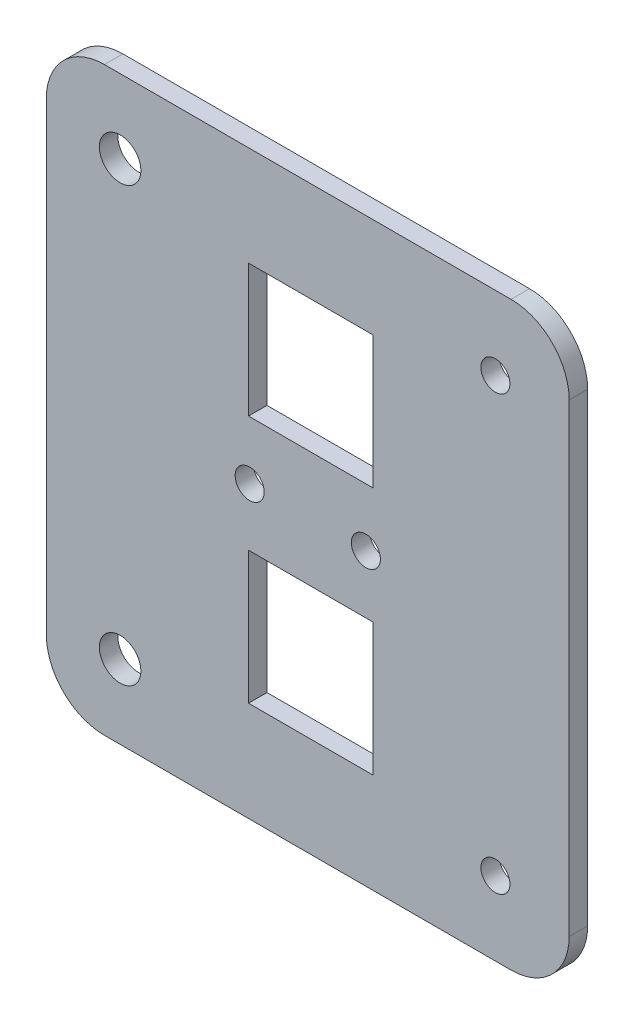
ISO-10303-21;
HEADER;
FILE_DESCRIPTION(('STEP AP214'),'2;1');
FILE_NAME('part.step','',(''),(''),'','','');
FILE_SCHEMA(('AUTOMOTIVE_DESIGN { 1 0 10303 214 1 1 1 1 }'));
ENDSEC;
DATA;
#1=APPLICATION_CONTEXT('core data for automotive mechanical design processes');
#2=APPLICATION_PROTOCOL_DEFINITION('international standard','automotive_design',2000,#1);
#3=PRODUCT_CONTEXT('',#1,'mechanical');
#4=PRODUCT('Part','Part','',(#3));
#5=PRODUCT_RELATED_PRODUCT_CATEGORY('part','',(#4));
#6=PRODUCT_DEFINITION_FORMATION('','',#4);
#7=PRODUCT_DEFINITION_CONTEXT('part definition',#1,'design');
#8=PRODUCT_DEFINITION('design','',#6,#7);
#9=PRODUCT_DEFINITION_SHAPE('','',#8);
#10=(LENGTH_UNIT() NAMED_UNIT(*) SI_UNIT(.MILLI.,.METRE.));
#11=(NAMED_UNIT(*) PLANE_ANGLE_UNIT() SI_UNIT($,.RADIAN.));
#12=(NAMED_UNIT(*) SI_UNIT($,.STERADIAN.) SOLID_ANGLE_UNIT());
#13=UNCERTAINTY_MEASURE_WITH_UNIT(LENGTH_MEASURE(1.E-05),#10,'distance_accuracy_value','');
#14=(GEOMETRIC_REPRESENTATION_CONTEXT(3) GLOBAL_UNCERTAINTY_ASSIGNED_CONTEXT((#13)) GLOBAL_UNIT_ASSIGNED_CONTEXT((#10,
#11,#12)) REPRESENTATION_CONTEXT('',''));
#15=CARTESIAN_POINT('',(0.,0.,0.));
#16=DIRECTION('',(0.,0.,1.));
#17=DIRECTION('',(1.,0.,0.));
#18=AXIS2_PLACEMENT_3D('',#15,#16,#17);
#19=CARTESIAN_POINT('',(-45.,-55.,15.98));
#20=DIRECTION('',(-1.,0.,0.));
#21=DIRECTION('',(0.,0.,1.));
#22=AXIS2_PLACEMENT_3D('',#19,#20,#21);
#23=PLANE('',#22);
#24=DIRECTION('',(0.,-1.,0.));
#25=VECTOR('',#24,1.);
#26=CARTESIAN_POINT('',(-45.,-55.,15.98));
#27=LINE('',#26,#25);
#28=CARTESIAN_POINT('',(-45.,35.,15.98));
#29=VERTEX_POINT('',#28);
#30=CARTESIAN_POINT('',(-45.,-45.,15.98));
#31=VERTEX_POINT('',#30);
#32=EDGE_CURVE('E255',#29,#31,#27,.T.);
#33=ORIENTED_EDGE('',*,*,#32,.T.);
#34=DIRECTION('',(0.,0.,1.));
#35=VECTOR('',#34,1.);
#36=CARTESIAN_POINT('',(-45.,-45.,15.98));
#37=LINE('',#36,#35);
#38=CARTESIAN_POINT('',(-45.,-45.,19.16));
#39=VERTEX_POINT('',#38);
#40=EDGE_CURVE('E306',#31,#39,#37,.T.);
#41=ORIENTED_EDGE('',*,*,#40,.T.);
#42=DIRECTION('',(0.,-1.,0.));
#43=VECTOR('',#42,1.);
#44=CARTESIAN_POINT('',(-45.,-55.,19.16));
#45=LINE('',#44,#43);
#46=CARTESIAN_POINT('',(-45.,35.,19.16));
#47=VERTEX_POINT('',#46);
#48=EDGE_CURVE('E252',#47,#39,#45,.T.);
#49=ORIENTED_EDGE('',*,*,#48,.F.);
#50=DIRECTION('',(0.,0.,1.));
#51=VECTOR('',#50,1.);
#52=CARTESIAN_POINT('',(-45.,35.,15.98));
#53=LINE('',#52,#51);
#54=EDGE_CURVE('E304',#47,#29,#53,.F.);
#55=ORIENTED_EDGE('',*,*,#54,.T.);
#56=EDGE_LOOP('',(#33,#41,#49,#55));
#57=FACE_BOUND('',#56,.T.);
#58=ADVANCED_FACE('F37',(#57),#23,.T.);
#59=CARTESIAN_POINT('',(-45.,45.,15.98));
#60=DIRECTION('',(0.,1.,0.));
#61=DIRECTION('',(0.,0.,1.));
#62=AXIS2_PLACEMENT_3D('',#59,#60,#61);
#63=PLANE('',#62);
#64=DIRECTION('',(-1.,0.,0.));
#65=VECTOR('',#64,1.);
#66=CARTESIAN_POINT('',(-45.,45.,15.98));
#67=LINE('',#66,#65);
#68=CARTESIAN_POINT('',(35.,45.,15.98));
#69=VERTEX_POINT('',#68);
#70=CARTESIAN_POINT('',(-35.,45.,15.98));
#71=VERTEX_POINT('',#70);
#72=EDGE_CURVE('E265',#69,#71,#67,.T.);
#73=ORIENTED_EDGE('',*,*,#72,.T.);
#74=DIRECTION('',(0.,0.,1.));
#75=VECTOR('',#74,1.);
#76=CARTESIAN_POINT('',(-35.,45.,15.98));
#77=LINE('',#76,#75);
#78=CARTESIAN_POINT('',(-35.,45.,19.16));
#79=VERTEX_POINT('',#78);
#80=EDGE_CURVE('E11',#71,#79,#77,.T.);
#81=ORIENTED_EDGE('',*,*,#80,.T.);
#82=DIRECTION('',(-1.,0.,0.));
#83=VECTOR('',#82,1.);
#84=CARTESIAN_POINT('',(-45.,45.,19.16));
#85=LINE('',#84,#83);
#86=CARTESIAN_POINT('',(35.,45.,19.16));
#87=VERTEX_POINT('',#86);
#88=EDGE_CURVE('E259',#87,#79,#85,.T.);
#89=ORIENTED_EDGE('',*,*,#88,.F.);
#90=DIRECTION('',(0.,0.,1.));
#91=VECTOR('',#90,1.);
#92=CARTESIAN_POINT('',(35.,45.,15.98));
#93=LINE('',#92,#91);
#94=EDGE_CURVE('E45',#87,#69,#93,.F.);
#95=ORIENTED_EDGE('',*,*,#94,.T.);
#96=EDGE_LOOP('',(#73,#81,#89,#95));
#97=FACE_BOUND('',#96,.T.);
#98=ADVANCED_FACE('F312',(#97),#63,.T.);
#99=CARTESIAN_POINT('',(45.,-55.,15.98));
#100=DIRECTION('',(1.,0.,0.));
#101=DIRECTION('',(0.,0.,-1.));
#102=AXIS2_PLACEMENT_3D('',#99,#100,#101);
#103=PLANE('',#102);
#104=DIRECTION('',(0.,1.,0.));
#105=VECTOR('',#104,1.);
#106=CARTESIAN_POINT('',(45.,-55.,19.16));
#107=LINE('',#106,#105);
#108=CARTESIAN_POINT('',(45.,-45.,19.16));
#109=VERTEX_POINT('',#108);
#110=CARTESIAN_POINT('',(45.,35.,19.16));
#111=VERTEX_POINT('',#110);
#112=EDGE_CURVE('E274',#109,#111,#107,.T.);
#113=ORIENTED_EDGE('',*,*,#112,.F.);
#114=DIRECTION('',(0.,0.,1.));
#115=VECTOR('',#114,1.);
#116=CARTESIAN_POINT('',(45.,-45.,15.98));
#117=LINE('',#116,#115);
#118=CARTESIAN_POINT('',(45.,-45.,15.98));
#119=VERTEX_POINT('',#118);
#120=EDGE_CURVE('E294',#109,#119,#117,.F.);
#121=ORIENTED_EDGE('',*,*,#120,.T.);
#122=DIRECTION('',(0.,1.,0.));
#123=VECTOR('',#122,1.);
#124=CARTESIAN_POINT('',(45.,-55.,15.98));
#125=LINE('',#124,#123);
#126=CARTESIAN_POINT('',(45.,35.,15.98));
#127=VERTEX_POINT('',#126);
#128=EDGE_CURVE('E262',#119,#127,#125,.T.);
#129=ORIENTED_EDGE('',*,*,#128,.T.);
#130=DIRECTION('',(0.,0.,1.));
#131=VECTOR('',#130,1.);
#132=CARTESIAN_POINT('',(45.,35.,15.98));
#133=LINE('',#132,#131);
#134=EDGE_CURVE('E291',#127,#111,#133,.T.);
#135=ORIENTED_EDGE('',*,*,#134,.T.);
#136=EDGE_LOOP('',(#113,#121,#129,#135));
#137=FACE_BOUND('',#136,.T.);
#138=ADVANCED_FACE('F324',(#137),#103,.T.);
#139=CARTESIAN_POINT('',(-45.,-55.,15.98));
#140=DIRECTION('',(0.,-1.,0.));
#141=DIRECTION('',(0.,0.,-1.));
#142=AXIS2_PLACEMENT_3D('',#139,#140,#141);
#143=PLANE('',#142);
#144=DIRECTION('',(1.,0.,0.));
#145=VECTOR('',#144,1.);
#146=CARTESIAN_POINT('',(-45.,-55.,15.98));
#147=LINE('',#146,#145);
#148=CARTESIAN_POINT('',(-35.,-55.,15.98));
#149=VERTEX_POINT('',#148);
#150=CARTESIAN_POINT('',(35.,-55.,15.98));
#151=VERTEX_POINT('',#150);
#152=EDGE_CURVE('E258',#149,#151,#147,.T.);
#153=ORIENTED_EDGE('',*,*,#152,.T.);
#154=DIRECTION('',(0.,0.,1.));
#155=VECTOR('',#154,1.);
#156=CARTESIAN_POINT('',(35.,-55.,15.98));
#157=LINE('',#156,#155);
#158=CARTESIAN_POINT('',(35.,-55.,19.16));
#159=VERTEX_POINT('',#158);
#160=EDGE_CURVE('E280',#151,#159,#157,.T.);
#161=ORIENTED_EDGE('',*,*,#160,.T.);
#162=DIRECTION('',(1.,0.,0.));
#163=VECTOR('',#162,1.);
#164=CARTESIAN_POINT('',(-45.,-55.,19.16));
#165=LINE('',#164,#163);
#166=CARTESIAN_POINT('',(-35.,-55.,19.16));
#167=VERTEX_POINT('',#166);
#168=EDGE_CURVE('E271',#167,#159,#165,.T.);
#169=ORIENTED_EDGE('',*,*,#168,.F.);
#170=DIRECTION('',(0.,0.,1.));
#171=VECTOR('',#170,1.);
#172=CARTESIAN_POINT('',(-35.,-55.,15.98));
#173=LINE('',#172,#171);
#174=EDGE_CURVE('E268',#167,#149,#173,.F.);
#175=ORIENTED_EDGE('',*,*,#174,.T.);
#176=EDGE_LOOP('',(#153,#161,#169,#175));
#177=FACE_BOUND('',#176,.T.);
#178=ADVANCED_FACE('F333',(#177),#143,.T.);
#179=CARTESIAN_POINT('',(0.,0.,15.98));
#180=DIRECTION('',(0.,0.,-1.));
#181=DIRECTION('',(-1.,0.,0.));
#182=AXIS2_PLACEMENT_3D('',#179,#180,#181);
#183=PLANE('',#182);
#184=DIRECTION('',(0.,1.,0.));
#185=VECTOR('',#184,1.);
#186=CARTESIAN_POINT('',(-10.2,5.00000000123002,15.98));
#187=LINE('',#186,#185);
#188=CARTESIAN_POINT('',(-10.2,5.00000000123002,15.98));
#189=VERTEX_POINT('',#188);
#190=CARTESIAN_POINT('',(-10.2,27.8105107042279,15.98));
#191=VERTEX_POINT('',#190);
#192=EDGE_CURVE('E52',#189,#191,#187,.T.);
#193=ORIENTED_EDGE('',*,*,#192,.F.);
#194=DIRECTION('',(-1.,0.,0.));
#195=VECTOR('',#194,1.);
#196=CARTESIAN_POINT('',(-10.2,5.00000000123002,15.98));
#197=LINE('',#196,#195);
#198=CARTESIAN_POINT('',(11.2,5.00000000123002,15.98));
#199=VERTEX_POINT('',#198);
#200=EDGE_CURVE('E168',#199,#189,#197,.T.);
#201=ORIENTED_EDGE('',*,*,#200,.F.);
#202=DIRECTION('',(0.,-1.,0.));
#203=VECTOR('',#202,1.);
#204=CARTESIAN_POINT('',(11.2,5.00000000123002,15.98));
#205=LINE('',#204,#203);
#206=CARTESIAN_POINT('',(11.2,27.8105107042279,15.98));
#207=VERTEX_POINT('',#206);
#208=EDGE_CURVE('E171',#207,#199,#205,.T.);
#209=ORIENTED_EDGE('',*,*,#208,.F.);
#210=DIRECTION('',(1.,0.,0.));
#211=VECTOR('',#210,1.);
#212=CARTESIAN_POINT('',(-10.2,27.8105107042279,15.98));
#213=LINE('',#212,#211);
#214=EDGE_CURVE('E177',#191,#207,#213,.T.);
#215=ORIENTED_EDGE('',*,*,#214,.F.);
#216=EDGE_LOOP('',(#193,#201,#209,#215));
#217=FACE_BOUND('',#216,.T.);
#218=DIRECTION('',(0.,1.,0.));
#219=VECTOR('',#218,1.);
#220=CARTESIAN_POINT('',(-10.2,-15.0000000012299,15.98));
#221=LINE('',#220,#219);
#222=CARTESIAN_POINT('',(-10.2,-37.8105107042278,15.98));
#223=VERTEX_POINT('',#222);
#224=CARTESIAN_POINT('',(-10.2,-15.0000000012299,15.98));
#225=VERTEX_POINT('',#224);
#226=EDGE_CURVE('E183',#223,#225,#221,.T.);
#227=ORIENTED_EDGE('',*,*,#226,.F.);
#228=DIRECTION('',(-1.,0.,0.));
#229=VECTOR('',#228,1.);
#230=CARTESIAN_POINT('',(-10.2,-37.8105107042278,15.98));
#231=LINE('',#230,#229);
#232=CARTESIAN_POINT('',(11.2,-37.8105107042278,15.98));
#233=VERTEX_POINT('',#232);
#234=EDGE_CURVE('E191',#233,#223,#231,.T.);
#235=ORIENTED_EDGE('',*,*,#234,.F.);
#236=DIRECTION('',(0.,-1.,0.));
#237=VECTOR('',#236,1.);
#238=CARTESIAN_POINT('',(11.2,-15.0000000012299,15.98));
#239=LINE('',#238,#237);
#240=CARTESIAN_POINT('',(11.2,-15.0000000012299,15.98));
#241=VERTEX_POINT('',#240);
#242=EDGE_CURVE('E205',#241,#233,#239,.T.);
#243=ORIENTED_EDGE('',*,*,#242,.F.);
#244=DIRECTION('',(1.,0.,0.));
#245=VECTOR('',#244,1.);
#246=CARTESIAN_POINT('',(-10.2,-15.0000000012299,15.98));
#247=LINE('',#246,#245);
#248=EDGE_CURVE('E202',#225,#241,#247,.T.);
#249=ORIENTED_EDGE('',*,*,#248,.F.);
#250=EDGE_LOOP('',(#227,#235,#243,#249));
#251=FACE_BOUND('',#250,.T.);
#252=CARTESIAN_POINT('',(-9.99999999999999,-4.99999999999996,15.98));
#253=DIRECTION('',(0.,0.,-1.));
#254=DIRECTION('',(-1.,0.,0.));
#255=AXIS2_PLACEMENT_3D('',#252,#253,#254);
#256=CIRCLE('',#255,2.5);
#257=CARTESIAN_POINT('',(-12.5,-4.99999999999996,15.98));
#258=VERTEX_POINT('',#257);
#259=EDGE_CURVE('E221',#258,#258,#256,.T.);
#260=ORIENTED_EDGE('',*,*,#259,.F.);
#261=EDGE_LOOP('',(#260));
#262=FACE_BOUND('',#261,.T.);
#263=CARTESIAN_POINT('',(10.,-4.99999999999995,15.98));
#264=DIRECTION('',(0.,0.,-1.));
#265=DIRECTION('',(-1.,0.,0.));
#266=AXIS2_PLACEMENT_3D('',#263,#264,#265);
#267=CIRCLE('',#266,2.5);
#268=CARTESIAN_POINT('',(7.50000000000001,-4.99999999999995,15.98));
#269=VERTEX_POINT('',#268);
#270=EDGE_CURVE('E227',#269,#269,#267,.T.);
#271=ORIENTED_EDGE('',*,*,#270,.F.);
#272=EDGE_LOOP('',(#271));
#273=FACE_BOUND('',#272,.T.);
#274=CARTESIAN_POINT('',(32.3,32.3000000000001,15.98));
#275=DIRECTION('',(0.,0.,1.));
#276=DIRECTION('',(1.,0.,0.));
#277=AXIS2_PLACEMENT_3D('',#274,#275,#276);
#278=CIRCLE('',#277,2.5);
#279=CARTESIAN_POINT('',(34.8,32.3000000000001,15.98));
#280=VERTEX_POINT('',#279);
#281=EDGE_CURVE('E231',#280,#280,#278,.T.);
#282=ORIENTED_EDGE('',*,*,#281,.T.);
#283=EDGE_LOOP('',(#282));
#284=FACE_BOUND('',#283,.T.);
#285=CARTESIAN_POINT('',(-32.3,32.3,15.98));
#286=DIRECTION('',(0.,0.,1.));
#287=DIRECTION('',(1.,0.,0.));
#288=AXIS2_PLACEMENT_3D('',#285,#286,#287);
#289=CIRCLE('',#288,3.57);
#290=CARTESIAN_POINT('',(-28.73,32.3,15.98));
#291=VERTEX_POINT('',#290);
#292=EDGE_CURVE('E237',#291,#291,#289,.T.);
#293=ORIENTED_EDGE('',*,*,#292,.T.);
#294=EDGE_LOOP('',(#293));
#295=FACE_BOUND('',#294,.T.);
#296=CARTESIAN_POINT('',(-32.3,-42.3,15.98));
#297=DIRECTION('',(0.,0.,1.));
#298=DIRECTION('',(1.,0.,0.));
#299=AXIS2_PLACEMENT_3D('',#296,#297,#298);
#300=CIRCLE('',#299,3.57);
#301=CARTESIAN_POINT('',(-28.73,-42.3,15.98));
#302=VERTEX_POINT('',#301);
#303=EDGE_CURVE('E243',#302,#302,#300,.T.);
#304=ORIENTED_EDGE('',*,*,#303,.T.);
#305=EDGE_LOOP('',(#304));
#306=FACE_BOUND('',#305,.T.);
#307=CARTESIAN_POINT('',(32.3,-42.3,15.98));
#308=DIRECTION('',(0.,0.,1.));
#309=DIRECTION('',(1.,0.,0.));
#310=AXIS2_PLACEMENT_3D('',#307,#308,#309);
#311=CIRCLE('',#310,2.5);
#312=CARTESIAN_POINT('',(34.8,-42.3,15.98));
#313=VERTEX_POINT('',#312);
#314=EDGE_CURVE('E249',#313,#313,#311,.T.);
#315=ORIENTED_EDGE('',*,*,#314,.T.);
#316=EDGE_LOOP('',(#315));
#317=FACE_BOUND('',#316,.T.);
#318=ORIENTED_EDGE('',*,*,#128,.F.);
#319=CARTESIAN_POINT('',(35.,-45.,15.98));
#320=DIRECTION('',(0.,0.,-1.));
#321=DIRECTION('',(-1.,0.,0.));
#322=AXIS2_PLACEMENT_3D('',#319,#320,#321);
#323=CIRCLE('',#322,10.);
#324=EDGE_CURVE('E302',#119,#151,#323,.T.);
#325=ORIENTED_EDGE('',*,*,#324,.T.);
#326=ORIENTED_EDGE('',*,*,#152,.F.);
#327=CARTESIAN_POINT('',(-35.,-45.,15.98));
#328=DIRECTION('',(0.,0.,-1.));
#329=DIRECTION('',(-1.,0.,0.));
#330=AXIS2_PLACEMENT_3D('',#327,#328,#329);
#331=CIRCLE('',#330,10.);
#332=EDGE_CURVE('E300',#149,#31,#331,.T.);
#333=ORIENTED_EDGE('',*,*,#332,.T.);
#334=ORIENTED_EDGE('',*,*,#32,.F.);
#335=CARTESIAN_POINT('',(-35.,35.,15.98));
#336=DIRECTION('',(0.,0.,-1.));
#337=DIRECTION('',(-1.,0.,0.));
#338=AXIS2_PLACEMENT_3D('',#335,#336,#337);
#339=CIRCLE('',#338,10.);
#340=EDGE_CURVE('E298',#29,#71,#339,.T.);
#341=ORIENTED_EDGE('',*,*,#340,.T.);
#342=ORIENTED_EDGE('',*,*,#72,.F.);
#343=CARTESIAN_POINT('',(35.,35.,15.98));
#344=DIRECTION('',(0.,0.,-1.));
#345=DIRECTION('',(-1.,0.,0.));
#346=AXIS2_PLACEMENT_3D('',#343,#344,#345);
#347=CIRCLE('',#346,10.);
#348=EDGE_CURVE('E296',#69,#127,#347,.T.);
#349=ORIENTED_EDGE('',*,*,#348,.T.);
#350=EDGE_LOOP('',(#318,#325,#326,#333,#334,#341,#342,#349));
#351=FACE_BOUND('',#350,.T.);
#352=ADVANCED_FACE('F318',(#217,#251,#262,#273,#284,#295,#306,#317,#351),#183,.T.);
#353=CARTESIAN_POINT('',(0.,0.,19.16));
#354=DIRECTION('',(0.,0.,-1.));
#355=DIRECTION('',(-1.,0.,0.));
#356=AXIS2_PLACEMENT_3D('',#353,#354,#355);
#357=PLANE('',#356);
#358=DIRECTION('',(-1.,0.,0.));
#359=VECTOR('',#358,1.);
#360=CARTESIAN_POINT('',(-10.2,5.00000000123002,19.16));
#361=LINE('',#360,#359);
#362=CARTESIAN_POINT('',(11.2,5.00000000123002,19.16));
#363=VERTEX_POINT('',#362);
#364=CARTESIAN_POINT('',(-10.2,5.00000000123002,19.16));
#365=VERTEX_POINT('',#364);
#366=EDGE_CURVE('E158',#363,#365,#361,.T.);
#367=ORIENTED_EDGE('',*,*,#366,.T.);
#368=DIRECTION('',(0.,1.,0.));
#369=VECTOR('',#368,1.);
#370=CARTESIAN_POINT('',(-10.2,5.00000000123002,19.16));
#371=LINE('',#370,#369);
#372=CARTESIAN_POINT('',(-10.2,27.8105107042279,19.16));
#373=VERTEX_POINT('',#372);
#374=EDGE_CURVE('E152',#365,#373,#371,.T.);
#375=ORIENTED_EDGE('',*,*,#374,.T.);
#376=DIRECTION('',(1.,0.,0.));
#377=VECTOR('',#376,1.);
#378=CARTESIAN_POINT('',(-10.2,27.8105107042279,19.16));
#379=LINE('',#378,#377);
#380=CARTESIAN_POINT('',(11.2,27.8105107042279,19.16));
#381=VERTEX_POINT('',#380);
#382=EDGE_CURVE('E161',#373,#381,#379,.T.);
#383=ORIENTED_EDGE('',*,*,#382,.T.);
#384=DIRECTION('',(0.,-1.,0.));
#385=VECTOR('',#384,1.);
#386=CARTESIAN_POINT('',(11.2,5.00000000123002,19.16));
#387=LINE('',#386,#385);
#388=EDGE_CURVE('E60',#381,#363,#387,.T.);
#389=ORIENTED_EDGE('',*,*,#388,.T.);
#390=EDGE_LOOP('',(#367,#375,#383,#389));
#391=FACE_BOUND('',#390,.T.);
#392=DIRECTION('',(-1.,0.,0.));
#393=VECTOR('',#392,1.);
#394=CARTESIAN_POINT('',(-10.2,-37.8105107042278,19.16));
#395=LINE('',#394,#393);
#396=CARTESIAN_POINT('',(11.2,-37.8105107042278,19.16));
#397=VERTEX_POINT('',#396);
#398=CARTESIAN_POINT('',(-10.2,-37.8105107042278,19.16));
#399=VERTEX_POINT('',#398);
#400=EDGE_CURVE('E197',#397,#399,#395,.T.);
#401=ORIENTED_EDGE('',*,*,#400,.T.);
#402=DIRECTION('',(0.,1.,0.));
#403=VECTOR('',#402,1.);
#404=CARTESIAN_POINT('',(-10.2,-15.0000000012299,19.16));
#405=LINE('',#404,#403);
#406=CARTESIAN_POINT('',(-10.2,-15.0000000012299,19.16));
#407=VERTEX_POINT('',#406);
#408=EDGE_CURVE('E187',#399,#407,#405,.T.);
#409=ORIENTED_EDGE('',*,*,#408,.T.);
#410=DIRECTION('',(1.,0.,0.));
#411=VECTOR('',#410,1.);
#412=CARTESIAN_POINT('',(-10.2,-15.0000000012299,19.16));
#413=LINE('',#412,#411);
#414=CARTESIAN_POINT('',(11.2,-15.0000000012299,19.16));
#415=VERTEX_POINT('',#414);
#416=EDGE_CURVE('E190',#407,#415,#413,.T.);
#417=ORIENTED_EDGE('',*,*,#416,.T.);
#418=DIRECTION('',(0.,-1.,0.));
#419=VECTOR('',#418,1.);
#420=CARTESIAN_POINT('',(11.2,-15.0000000012299,19.16));
#421=LINE('',#420,#419);
#422=EDGE_CURVE('E194',#415,#397,#421,.T.);
#423=ORIENTED_EDGE('',*,*,#422,.T.);
#424=EDGE_LOOP('',(#401,#409,#417,#423));
#425=FACE_BOUND('',#424,.T.);
#426=CARTESIAN_POINT('',(-9.99999999999999,-4.99999999999996,19.16));
#427=DIRECTION('',(0.,0.,1.));
#428=DIRECTION('',(1.,0.,0.));
#429=AXIS2_PLACEMENT_3D('',#426,#427,#428);
#430=CIRCLE('',#429,2.5);
#431=CARTESIAN_POINT('',(-7.49999999999999,-4.99999999999996,19.16));
#432=VERTEX_POINT('',#431);
#433=EDGE_CURVE('E212',#432,#432,#430,.T.);
#434=ORIENTED_EDGE('',*,*,#433,.F.);
#435=EDGE_LOOP('',(#434));
#436=FACE_BOUND('',#435,.T.);
#437=CARTESIAN_POINT('',(10.,-4.99999999999995,19.16));
#438=DIRECTION('',(0.,0.,1.));
#439=DIRECTION('',(1.,0.,0.));
#440=AXIS2_PLACEMENT_3D('',#437,#438,#439);
#441=CIRCLE('',#440,2.5);
#442=CARTESIAN_POINT('',(12.5,-4.99999999999995,19.16));
#443=VERTEX_POINT('',#442);
#444=EDGE_CURVE('E224',#443,#443,#441,.T.);
#445=ORIENTED_EDGE('',*,*,#444,.F.);
#446=EDGE_LOOP('',(#445));
#447=FACE_BOUND('',#446,.T.);
#448=CARTESIAN_POINT('',(32.3,32.3000000000001,19.16));
#449=DIRECTION('',(0.,0.,1.));
#450=DIRECTION('',(1.,0.,0.));
#451=AXIS2_PLACEMENT_3D('',#448,#449,#450);
#452=CIRCLE('',#451,2.5);
#453=CARTESIAN_POINT('',(34.8,32.3000000000001,19.16));
#454=VERTEX_POINT('',#453);
#455=EDGE_CURVE('E230',#454,#454,#452,.T.);
#456=ORIENTED_EDGE('',*,*,#455,.F.);
#457=EDGE_LOOP('',(#456));
#458=FACE_BOUND('',#457,.T.);
#459=CARTESIAN_POINT('',(-32.3,32.3,19.16));
#460=DIRECTION('',(0.,0.,1.));
#461=DIRECTION('',(1.,0.,0.));
#462=AXIS2_PLACEMENT_3D('',#459,#460,#461);
#463=CIRCLE('',#462,3.57);
#464=CARTESIAN_POINT('',(-28.73,32.3,19.16));
#465=VERTEX_POINT('',#464);
#466=EDGE_CURVE('E234',#465,#465,#463,.T.);
#467=ORIENTED_EDGE('',*,*,#466,.F.);
#468=EDGE_LOOP('',(#467));
#469=FACE_BOUND('',#468,.T.);
#470=CARTESIAN_POINT('',(-32.3,-42.3,19.16));
#471=DIRECTION('',(0.,0.,1.));
#472=DIRECTION('',(1.,0.,0.));
#473=AXIS2_PLACEMENT_3D('',#470,#471,#472);
#474=CIRCLE('',#473,3.57);
#475=CARTESIAN_POINT('',(-28.73,-42.3,19.16));
#476=VERTEX_POINT('',#475);
#477=EDGE_CURVE('E240',#476,#476,#474,.T.);
#478=ORIENTED_EDGE('',*,*,#477,.F.);
#479=EDGE_LOOP('',(#478));
#480=FACE_BOUND('',#479,.T.);
#481=CARTESIAN_POINT('',(32.3,-42.3,19.16));
#482=DIRECTION('',(0.,0.,1.));
#483=DIRECTION('',(1.,0.,0.));
#484=AXIS2_PLACEMENT_3D('',#481,#482,#483);
#485=CIRCLE('',#484,2.5);
#486=CARTESIAN_POINT('',(34.8,-42.3,19.16));
#487=VERTEX_POINT('',#486);
#488=EDGE_CURVE('E246',#487,#487,#485,.T.);
#489=ORIENTED_EDGE('',*,*,#488,.F.);
#490=EDGE_LOOP('',(#489));
#491=FACE_BOUND('',#490,.T.);
#492=ORIENTED_EDGE('',*,*,#168,.T.);
#493=CARTESIAN_POINT('',(35.,-45.,19.16));
#494=DIRECTION('',(0.,0.,-1.));
#495=DIRECTION('',(-1.,0.,0.));
#496=AXIS2_PLACEMENT_3D('',#493,#494,#495);
#497=CIRCLE('',#496,10.);
#498=EDGE_CURVE('E289',#159,#109,#497,.F.);
#499=ORIENTED_EDGE('',*,*,#498,.T.);
#500=ORIENTED_EDGE('',*,*,#112,.T.);
#501=CARTESIAN_POINT('',(35.,35.,19.16));
#502=DIRECTION('',(0.,0.,-1.));
#503=DIRECTION('',(-1.,0.,0.));
#504=AXIS2_PLACEMENT_3D('',#501,#502,#503);
#505=CIRCLE('',#504,10.);
#506=EDGE_CURVE('E283',#111,#87,#505,.F.);
#507=ORIENTED_EDGE('',*,*,#506,.T.);
#508=ORIENTED_EDGE('',*,*,#88,.T.);
#509=CARTESIAN_POINT('',(-35.,35.,19.16));
#510=DIRECTION('',(0.,0.,-1.));
#511=DIRECTION('',(-1.,0.,0.));
#512=AXIS2_PLACEMENT_3D('',#509,#510,#511);
#513=CIRCLE('',#512,10.);
#514=EDGE_CURVE('E285',#79,#47,#513,.F.);
#515=ORIENTED_EDGE('',*,*,#514,.T.);
#516=ORIENTED_EDGE('',*,*,#48,.T.);
#517=CARTESIAN_POINT('',(-35.,-45.,19.16));
#518=DIRECTION('',(0.,0.,-1.));
#519=DIRECTION('',(-1.,0.,0.));
#520=AXIS2_PLACEMENT_3D('',#517,#518,#519);
#521=CIRCLE('',#520,10.);
#522=EDGE_CURVE('E287',#39,#167,#521,.F.);
#523=ORIENTED_EDGE('',*,*,#522,.T.);
#524=EDGE_LOOP('',(#492,#499,#500,#507,#508,#515,#516,#523));
#525=FACE_BOUND('',#524,.T.);
#526=ADVANCED_FACE('F165',(#391,#425,#436,#447,#458,#469,#480,#491,#525),#357,.F.);
#527=CARTESIAN_POINT('',(32.3,-42.3,15.98));
#528=DIRECTION('',(0.,0.,1.));
#529=DIRECTION('',(1.,0.,0.));
#530=AXIS2_PLACEMENT_3D('',#527,#528,#529);
#531=CYLINDRICAL_SURFACE('',#530,2.5);
#532=CARTESIAN_POINT('',(34.8,-42.3,15.98));
#533=CARTESIAN_POINT('',(34.8,-42.3,16.013125));
#534=CARTESIAN_POINT('',(34.8,-42.3,16.04625));
#535=CARTESIAN_POINT('',(34.8,-42.3,16.1125));
#536=CARTESIAN_POINT('',(34.8,-42.3,16.145625));
#537=CARTESIAN_POINT('',(34.8,-42.3,16.211875));
#538=CARTESIAN_POINT('',(34.8,-42.3,16.245));
#539=CARTESIAN_POINT('',(34.8,-42.3,16.31125));
#540=CARTESIAN_POINT('',(34.8,-42.3,16.344375));
#541=CARTESIAN_POINT('',(34.8,-42.3,16.410625));
#542=CARTESIAN_POINT('',(34.8,-42.3,16.44375));
#543=CARTESIAN_POINT('',(34.8,-42.3,16.51));
#544=CARTESIAN_POINT('',(34.8,-42.3,16.543125));
#545=CARTESIAN_POINT('',(34.8,-42.3,16.609375));
#546=CARTESIAN_POINT('',(34.8,-42.3,16.6425));
#547=CARTESIAN_POINT('',(34.8,-42.3,16.70875));
#548=CARTESIAN_POINT('',(34.8,-42.3,16.741875));
#549=CARTESIAN_POINT('',(34.8,-42.3,16.808125));
#550=CARTESIAN_POINT('',(34.8,-42.3,16.84125));
#551=CARTESIAN_POINT('',(34.8,-42.3,16.9075));
#552=CARTESIAN_POINT('',(34.8,-42.3,16.940625));
#553=CARTESIAN_POINT('',(34.8,-42.3,17.006875));
#554=CARTESIAN_POINT('',(34.8,-42.3,17.04));
#555=CARTESIAN_POINT('',(34.8,-42.3,17.10625));
#556=CARTESIAN_POINT('',(34.8,-42.3,17.139375));
#557=CARTESIAN_POINT('',(34.8,-42.3,17.205625));
#558=CARTESIAN_POINT('',(34.8,-42.3,17.23875));
#559=CARTESIAN_POINT('',(34.8,-42.3,17.305));
#560=CARTESIAN_POINT('',(34.8,-42.3,17.338125));
#561=CARTESIAN_POINT('',(34.8,-42.3,17.404375));
#562=CARTESIAN_POINT('',(34.8,-42.3,17.4375));
#563=CARTESIAN_POINT('',(34.8,-42.3,17.50375));
#564=CARTESIAN_POINT('',(34.8,-42.3,17.536875));
#565=CARTESIAN_POINT('',(34.8,-42.3,17.603125));
#566=CARTESIAN_POINT('',(34.8,-42.3,17.63625));
#567=CARTESIAN_POINT('',(34.8,-42.3,17.7025));
#568=CARTESIAN_POINT('',(34.8,-42.3,17.735625));
#569=CARTESIAN_POINT('',(34.8,-42.3,17.801875));
#570=CARTESIAN_POINT('',(34.8,-42.3,17.835));
#571=CARTESIAN_POINT('',(34.8,-42.3,17.90125));
#572=CARTESIAN_POINT('',(34.8,-42.3,17.934375));
#573=CARTESIAN_POINT('',(34.8,-42.3,18.000625));
#574=CARTESIAN_POINT('',(34.8,-42.3,18.03375));
#575=CARTESIAN_POINT('',(34.8,-42.3,18.1));
#576=CARTESIAN_POINT('',(34.8,-42.3,18.133125));
#577=CARTESIAN_POINT('',(34.8,-42.3,18.199375));
#578=CARTESIAN_POINT('',(34.8,-42.3,18.2325));
#579=CARTESIAN_POINT('',(34.8,-42.3,18.29875));
#580=CARTESIAN_POINT('',(34.8,-42.3,18.331875));
#581=CARTESIAN_POINT('',(34.8,-42.3,18.398125));
#582=CARTESIAN_POINT('',(34.8,-42.3,18.43125));
#583=CARTESIAN_POINT('',(34.8,-42.3,18.4975));
#584=CARTESIAN_POINT('',(34.8,-42.3,18.530625));
#585=CARTESIAN_POINT('',(34.8,-42.3,18.596875));
#586=CARTESIAN_POINT('',(34.8,-42.3,18.63));
#587=CARTESIAN_POINT('',(34.8,-42.3,18.69625));
#588=CARTESIAN_POINT('',(34.8,-42.3,18.729375));
#589=CARTESIAN_POINT('',(34.8,-42.3,18.795625));
#590=CARTESIAN_POINT('',(34.8,-42.3,18.82875));
#591=CARTESIAN_POINT('',(34.8,-42.3,18.895));
#592=CARTESIAN_POINT('',(34.8,-42.3,18.928125));
#593=CARTESIAN_POINT('',(34.8,-42.3,18.994375));
#594=CARTESIAN_POINT('',(34.8,-42.3,19.0275));
#595=CARTESIAN_POINT('',(34.8,-42.3,19.09375));
#596=CARTESIAN_POINT('',(34.8,-42.3,19.126875));
#597=CARTESIAN_POINT('',(34.8,-42.3,19.16));
#598=B_SPLINE_CURVE_WITH_KNOTS('',3,(#532,#533,#534,#535,#536,#537,#538,#539,#540,#541,#542,
#543,#544,#545,#546,#547,#548,#549,#550,#551,#552,#553,#554,#555,#556,#557,#558,#559,#560,#561,
#562,#563,#564,#565,#566,#567,#568,#569,#570,#571,#572,#573,#574,#575,#576,#577,#578,#579,#580,
#581,#582,#583,#584,#585,#586,#587,#588,#589,#590,#591,#592,#593,#594,#595,#596,#597),
.UNSPECIFIED.,.F.,.F.,(4,2,2,2,2,2,2,2,2,2,2,2,2,2,2,2,2,2,2,2,2,2,2,2,2,2,2,2,2,2,2,2,4),(0.,
0.0993749999999988,0.198749999999998,0.298125,0.397499999999999,0.496874999999997,0.59625,
0.695624999999998,0.794999999999997,0.894374999999999,0.993749999999998,1.093125,1.1925,
1.291875,1.39125,1.490625,1.59,1.689375,1.78875,1.888125,1.9875,2.086875,2.18625,2.285625,2.385,
2.484375,2.58375,2.683125,2.7825,2.881875,2.98125,3.080625,3.18),.UNSPECIFIED.);
#599=EDGE_CURVE('BSEAM382',#313,#487,#598,.T.);
#600=ORIENTED_EDGE('',*,*,#314,.F.);
#601=ORIENTED_EDGE('',*,*,#488,.T.);
#602=ORIENTED_EDGE('',*,*,#599,.T.);
#603=ORIENTED_EDGE('',*,*,#599,.F.);
#604=EDGE_LOOP('',(#600,#602,#601,#603));
#605=FACE_BOUND('',#604,.T.);
#606=ADVANCED_FACE('F382',(#605),#531,.F.);
#607=CARTESIAN_POINT('',(-32.3,-42.3,15.98));
#608=DIRECTION('',(0.,0.,1.));
#609=DIRECTION('',(1.,0.,0.));
#610=AXIS2_PLACEMENT_3D('',#607,#608,#609);
#611=CYLINDRICAL_SURFACE('',#610,3.57);
#612=CARTESIAN_POINT('',(-28.73,-42.3,15.98));
#613=CARTESIAN_POINT('',(-28.73,-42.3,16.013125));
#614=CARTESIAN_POINT('',(-28.73,-42.3,16.04625));
#615=CARTESIAN_POINT('',(-28.73,-42.3,16.1125));
#616=CARTESIAN_POINT('',(-28.73,-42.3,16.145625));
#617=CARTESIAN_POINT('',(-28.73,-42.3,16.211875));
#618=CARTESIAN_POINT('',(-28.73,-42.3,16.245));
#619=CARTESIAN_POINT('',(-28.73,-42.3,16.31125));
#620=CARTESIAN_POINT('',(-28.73,-42.3,16.344375));
#621=CARTESIAN_POINT('',(-28.73,-42.3,16.410625));
#622=CARTESIAN_POINT('',(-28.73,-42.3,16.44375));
#623=CARTESIAN_POINT('',(-28.73,-42.3,16.51));
#624=CARTESIAN_POINT('',(-28.73,-42.3,16.543125));
#625=CARTESIAN_POINT('',(-28.73,-42.3,16.609375));
#626=CARTESIAN_POINT('',(-28.73,-42.3,16.6425));
#627=CARTESIAN_POINT('',(-28.73,-42.3,16.70875));
#628=CARTESIAN_POINT('',(-28.73,-42.3,16.741875));
#629=CARTESIAN_POINT('',(-28.73,-42.3,16.808125));
#630=CARTESIAN_POINT('',(-28.73,-42.3,16.84125));
#631=CARTESIAN_POINT('',(-28.73,-42.3,16.9075));
#632=CARTESIAN_POINT('',(-28.73,-42.3,16.940625));
#633=CARTESIAN_POINT('',(-28.73,-42.3,17.006875));
#634=CARTESIAN_POINT('',(-28.73,-42.3,17.04));
#635=CARTESIAN_POINT('',(-28.73,-42.3,17.10625));
#636=CARTESIAN_POINT('',(-28.73,-42.3,17.139375));
#637=CARTESIAN_POINT('',(-28.73,-42.3,17.205625));
#638=CARTESIAN_POINT('',(-28.73,-42.3,17.23875));
#639=CARTESIAN_POINT('',(-28.73,-42.3,17.305));
#640=CARTESIAN_POINT('',(-28.73,-42.3,17.338125));
#641=CARTESIAN_POINT('',(-28.73,-42.3,17.404375));
#642=CARTESIAN_POINT('',(-28.73,-42.3,17.4375));
#643=CARTESIAN_POINT('',(-28.73,-42.3,17.50375));
#644=CARTESIAN_POINT('',(-28.73,-42.3,17.536875));
#645=CARTESIAN_POINT('',(-28.73,-42.3,17.603125));
#646=CARTESIAN_POINT('',(-28.73,-42.3,17.63625));
#647=CARTESIAN_POINT('',(-28.73,-42.3,17.7025));
#648=CARTESIAN_POINT('',(-28.73,-42.3,17.735625));
#649=CARTESIAN_POINT('',(-28.73,-42.3,17.801875));
#650=CARTESIAN_POINT('',(-28.73,-42.3,17.835));
#651=CARTESIAN_POINT('',(-28.73,-42.3,17.90125));
#652=CARTESIAN_POINT('',(-28.73,-42.3,17.934375));
#653=CARTESIAN_POINT('',(-28.73,-42.3,18.000625));
#654=CARTESIAN_POINT('',(-28.73,-42.3,18.03375));
#655=CARTESIAN_POINT('',(-28.73,-42.3,18.1));
#656=CARTESIAN_POINT('',(-28.73,-42.3,18.133125));
#657=CARTESIAN_POINT('',(-28.73,-42.3,18.199375));
#658=CARTESIAN_POINT('',(-28.73,-42.3,18.2325));
#659=CARTESIAN_POINT('',(-28.73,-42.3,18.29875));
#660=CARTESIAN_POINT('',(-28.73,-42.3,18.331875));
#661=CARTESIAN_POINT('',(-28.73,-42.3,18.398125));
#662=CARTESIAN_POINT('',(-28.73,-42.3,18.43125));
#663=CARTESIAN_POINT('',(-28.73,-42.3,18.4975));
#664=CARTESIAN_POINT('',(-28.73,-42.3,18.530625));
#665=CARTESIAN_POINT('',(-28.73,-42.3,18.596875));
#666=CARTESIAN_POINT('',(-28.73,-42.3,18.63));
#667=CARTESIAN_POINT('',(-28.73,-42.3,18.69625));
#668=CARTESIAN_POINT('',(-28.73,-42.3,18.729375));
#669=CARTESIAN_POINT('',(-28.73,-42.3,18.795625));
#670=CARTESIAN_POINT('',(-28.73,-42.3,18.82875));
#671=CARTESIAN_POINT('',(-28.73,-42.3,18.895));
#672=CARTESIAN_POINT('',(-28.73,-42.3,18.928125));
#673=CARTESIAN_POINT('',(-28.73,-42.3,18.994375));
#674=CARTESIAN_POINT('',(-28.73,-42.3,19.0275));
#675=CARTESIAN_POINT('',(-28.73,-42.3,19.09375));
#676=CARTESIAN_POINT('',(-28.73,-42.3,19.126875));
#677=CARTESIAN_POINT('',(-28.73,-42.3,19.16));
#678=B_SPLINE_CURVE_WITH_KNOTS('',3,(#612,#613,#614,#615,#616,#617,#618,#619,#620,#621,#622,
#623,#624,#625,#626,#627,#628,#629,#630,#631,#632,#633,#634,#635,#636,#637,#638,#639,#640,#641,
#642,#643,#644,#645,#646,#647,#648,#649,#650,#651,#652,#653,#654,#655,#656,#657,#658,#659,#660,
#661,#662,#663,#664,#665,#666,#667,#668,#669,#670,#671,#672,#673,#674,#675,#676,#677),
.UNSPECIFIED.,.F.,.F.,(4,2,2,2,2,2,2,2,2,2,2,2,2,2,2,2,2,2,2,2,2,2,2,2,2,2,2,2,2,2,2,2,4),(0.,
0.0993749999999988,0.198749999999998,0.298125,0.397499999999999,0.496874999999997,0.59625,
0.695624999999998,0.794999999999997,0.894374999999999,0.993749999999998,1.093125,1.1925,
1.291875,1.39125,1.490625,1.59,1.689375,1.78875,1.888125,1.9875,2.086875,2.18625,2.285625,2.385,
2.484375,2.58375,2.683125,2.7825,2.881875,2.98125,3.080625,3.18),.UNSPECIFIED.);
#679=EDGE_CURVE('BSEAM372',#302,#476,#678,.T.);
#680=ORIENTED_EDGE('',*,*,#303,.F.);
#681=ORIENTED_EDGE('',*,*,#477,.T.);
#682=ORIENTED_EDGE('',*,*,#679,.T.);
#683=ORIENTED_EDGE('',*,*,#679,.F.);
#684=EDGE_LOOP('',(#680,#682,#681,#683));
#685=FACE_BOUND('',#684,.T.);
#686=ADVANCED_FACE('F372',(#685),#611,.F.);
#687=CARTESIAN_POINT('',(-32.3,32.3,15.98));
#688=DIRECTION('',(0.,0.,1.));
#689=DIRECTION('',(1.,0.,0.));
#690=AXIS2_PLACEMENT_3D('',#687,#688,#689);
#691=CYLINDRICAL_SURFACE('',#690,3.57);
#692=CARTESIAN_POINT('',(-28.73,32.3,15.98));
#693=CARTESIAN_POINT('',(-28.73,32.3,16.013125));
#694=CARTESIAN_POINT('',(-28.73,32.3,16.04625));
#695=CARTESIAN_POINT('',(-28.73,32.3,16.1125));
#696=CARTESIAN_POINT('',(-28.73,32.3,16.145625));
#697=CARTESIAN_POINT('',(-28.73,32.3,16.211875));
#698=CARTESIAN_POINT('',(-28.73,32.3,16.245));
#699=CARTESIAN_POINT('',(-28.73,32.3,16.31125));
#700=CARTESIAN_POINT('',(-28.73,32.3,16.344375));
#701=CARTESIAN_POINT('',(-28.73,32.3,16.410625));
#702=CARTESIAN_POINT('',(-28.73,32.3,16.44375));
#703=CARTESIAN_POINT('',(-28.73,32.3,16.51));
#704=CARTESIAN_POINT('',(-28.73,32.3,16.543125));
#705=CARTESIAN_POINT('',(-28.73,32.3,16.609375));
#706=CARTESIAN_POINT('',(-28.73,32.3,16.6425));
#707=CARTESIAN_POINT('',(-28.73,32.3,16.70875));
#708=CARTESIAN_POINT('',(-28.73,32.3,16.741875));
#709=CARTESIAN_POINT('',(-28.73,32.3,16.808125));
#710=CARTESIAN_POINT('',(-28.73,32.3,16.84125));
#711=CARTESIAN_POINT('',(-28.73,32.3,16.9075));
#712=CARTESIAN_POINT('',(-28.73,32.3,16.940625));
#713=CARTESIAN_POINT('',(-28.73,32.3,17.006875));
#714=CARTESIAN_POINT('',(-28.73,32.3,17.04));
#715=CARTESIAN_POINT('',(-28.73,32.3,17.10625));
#716=CARTESIAN_POINT('',(-28.73,32.3,17.139375));
#717=CARTESIAN_POINT('',(-28.73,32.3,17.205625));
#718=CARTESIAN_POINT('',(-28.73,32.3,17.23875));
#719=CARTESIAN_POINT('',(-28.73,32.3,17.305));
#720=CARTESIAN_POINT('',(-28.73,32.3,17.338125));
#721=CARTESIAN_POINT('',(-28.73,32.3,17.404375));
#722=CARTESIAN_POINT('',(-28.73,32.3,17.4375));
#723=CARTESIAN_POINT('',(-28.73,32.3,17.50375));
#724=CARTESIAN_POINT('',(-28.73,32.3,17.536875));
#725=CARTESIAN_POINT('',(-28.73,32.3,17.603125));
#726=CARTESIAN_POINT('',(-28.73,32.3,17.63625));
#727=CARTESIAN_POINT('',(-28.73,32.3,17.7025));
#728=CARTESIAN_POINT('',(-28.73,32.3,17.735625));
#729=CARTESIAN_POINT('',(-28.73,32.3,17.801875));
#730=CARTESIAN_POINT('',(-28.73,32.3,17.835));
#731=CARTESIAN_POINT('',(-28.73,32.3,17.90125));
#732=CARTESIAN_POINT('',(-28.73,32.3,17.934375));
#733=CARTESIAN_POINT('',(-28.73,32.3,18.000625));
#734=CARTESIAN_POINT('',(-28.73,32.3,18.03375));
#735=CARTESIAN_POINT('',(-28.73,32.3,18.1));
#736=CARTESIAN_POINT('',(-28.73,32.3,18.133125));
#737=CARTESIAN_POINT('',(-28.73,32.3,18.199375));
#738=CARTESIAN_POINT('',(-28.73,32.3,18.2325));
#739=CARTESIAN_POINT('',(-28.73,32.3,18.29875));
#740=CARTESIAN_POINT('',(-28.73,32.3,18.331875));
#741=CARTESIAN_POINT('',(-28.73,32.3,18.398125));
#742=CARTESIAN_POINT('',(-28.73,32.3,18.43125));
#743=CARTESIAN_POINT('',(-28.73,32.3,18.4975));
#744=CARTESIAN_POINT('',(-28.73,32.3,18.530625));
#745=CARTESIAN_POINT('',(-28.73,32.3,18.596875));
#746=CARTESIAN_POINT('',(-28.73,32.3,18.63));
#747=CARTESIAN_POINT('',(-28.73,32.3,18.69625));
#748=CARTESIAN_POINT('',(-28.73,32.3,18.729375));
#749=CARTESIAN_POINT('',(-28.73,32.3,18.795625));
#750=CARTESIAN_POINT('',(-28.73,32.3,18.82875));
#751=CARTESIAN_POINT('',(-28.73,32.3,18.895));
#752=CARTESIAN_POINT('',(-28.73,32.3,18.928125));
#753=CARTESIAN_POINT('',(-28.73,32.3,18.994375));
#754=CARTESIAN_POINT('',(-28.73,32.3,19.0275));
#755=CARTESIAN_POINT('',(-28.73,32.3,19.09375));
#756=CARTESIAN_POINT('',(-28.73,32.3,19.126875));
#757=CARTESIAN_POINT('',(-28.73,32.3,19.16));
#758=B_SPLINE_CURVE_WITH_KNOTS('',3,(#692,#693,#694,#695,#696,#697,#698,#699,#700,#701,#702,
#703,#704,#705,#706,#707,#708,#709,#710,#711,#712,#713,#714,#715,#716,#717,#718,#719,#720,#721,
#722,#723,#724,#725,#726,#727,#728,#729,#730,#731,#732,#733,#734,#735,#736,#737,#738,#739,#740,
#741,#742,#743,#744,#745,#746,#747,#748,#749,#750,#751,#752,#753,#754,#755,#756,#757),
.UNSPECIFIED.,.F.,.F.,(4,2,2,2,2,2,2,2,2,2,2,2,2,2,2,2,2,2,2,2,2,2,2,2,2,2,2,2,2,2,2,2,4),(0.,
0.0993749999999988,0.198749999999998,0.298125,0.397499999999999,0.496874999999997,0.59625,
0.695624999999998,0.794999999999997,0.894374999999999,0.993749999999998,1.093125,1.1925,
1.291875,1.39125,1.490625,1.59,1.689375,1.78875,1.888125,1.9875,2.086875,2.18625,2.285625,2.385,
2.484375,2.58375,2.683125,2.7825,2.881875,2.98125,3.080625,3.18),.UNSPECIFIED.);
#759=EDGE_CURVE('BSEAM366',#291,#465,#758,.T.);
#760=ORIENTED_EDGE('',*,*,#292,.F.);
#761=ORIENTED_EDGE('',*,*,#466,.T.);
#762=ORIENTED_EDGE('',*,*,#759,.T.);
#763=ORIENTED_EDGE('',*,*,#759,.F.);
#764=EDGE_LOOP('',(#760,#762,#761,#763));
#765=FACE_BOUND('',#764,.T.);
#766=ADVANCED_FACE('F366',(#765),#691,.F.);
#767=CARTESIAN_POINT('',(32.3,32.3000000000001,15.98));
#768=DIRECTION('',(0.,0.,1.));
#769=DIRECTION('',(1.,0.,0.));
#770=AXIS2_PLACEMENT_3D('',#767,#768,#769);
#771=CYLINDRICAL_SURFACE('',#770,2.5);
#772=CARTESIAN_POINT('',(34.8,32.3000000000001,15.98));
#773=CARTESIAN_POINT('',(34.8,32.3000000000001,16.013125));
#774=CARTESIAN_POINT('',(34.8,32.3000000000001,16.04625));
#775=CARTESIAN_POINT('',(34.8,32.3000000000001,16.1125));
#776=CARTESIAN_POINT('',(34.8,32.3000000000001,16.145625));
#777=CARTESIAN_POINT('',(34.8,32.3000000000001,16.211875));
#778=CARTESIAN_POINT('',(34.8,32.3000000000001,16.245));
#779=CARTESIAN_POINT('',(34.8,32.3000000000001,16.31125));
#780=CARTESIAN_POINT('',(34.8,32.3000000000001,16.344375));
#781=CARTESIAN_POINT('',(34.8,32.3000000000001,16.410625));
#782=CARTESIAN_POINT('',(34.8,32.3000000000001,16.44375));
#783=CARTESIAN_POINT('',(34.8,32.3000000000001,16.51));
#784=CARTESIAN_POINT('',(34.8,32.3000000000001,16.543125));
#785=CARTESIAN_POINT('',(34.8,32.3000000000001,16.609375));
#786=CARTESIAN_POINT('',(34.8,32.3000000000001,16.6425));
#787=CARTESIAN_POINT('',(34.8,32.3000000000001,16.70875));
#788=CARTESIAN_POINT('',(34.8,32.3000000000001,16.741875));
#789=CARTESIAN_POINT('',(34.8,32.3000000000001,16.808125));
#790=CARTESIAN_POINT('',(34.8,32.3000000000001,16.84125));
#791=CARTESIAN_POINT('',(34.8,32.3000000000001,16.9075));
#792=CARTESIAN_POINT('',(34.8,32.3000000000001,16.940625));
#793=CARTESIAN_POINT('',(34.8,32.3000000000001,17.006875));
#794=CARTESIAN_POINT('',(34.8,32.3000000000001,17.04));
#795=CARTESIAN_POINT('',(34.8,32.3000000000001,17.10625));
#796=CARTESIAN_POINT('',(34.8,32.3000000000001,17.139375));
#797=CARTESIAN_POINT('',(34.8,32.3000000000001,17.205625));
#798=CARTESIAN_POINT('',(34.8,32.3000000000001,17.23875));
#799=CARTESIAN_POINT('',(34.8,32.3000000000001,17.305));
#800=CARTESIAN_POINT('',(34.8,32.3000000000001,17.338125));
#801=CARTESIAN_POINT('',(34.8,32.3000000000001,17.404375));
#802=CARTESIAN_POINT('',(34.8,32.3000000000001,17.4375));
#803=CARTESIAN_POINT('',(34.8,32.3000000000001,17.50375));
#804=CARTESIAN_POINT('',(34.8,32.3000000000001,17.536875));
#805=CARTESIAN_POINT('',(34.8,32.3000000000001,17.603125));
#806=CARTESIAN_POINT('',(34.8,32.3000000000001,17.63625));
#807=CARTESIAN_POINT('',(34.8,32.3000000000001,17.7025));
#808=CARTESIAN_POINT('',(34.8,32.3000000000001,17.735625));
#809=CARTESIAN_POINT('',(34.8,32.3000000000001,17.801875));
#810=CARTESIAN_POINT('',(34.8,32.3000000000001,17.835));
#811=CARTESIAN_POINT('',(34.8,32.3000000000001,17.90125));
#812=CARTESIAN_POINT('',(34.8,32.3000000000001,17.934375));
#813=CARTESIAN_POINT('',(34.8,32.3000000000001,18.000625));
#814=CARTESIAN_POINT('',(34.8,32.3000000000001,18.03375));
#815=CARTESIAN_POINT('',(34.8,32.3000000000001,18.1));
#816=CARTESIAN_POINT('',(34.8,32.3000000000001,18.133125));
#817=CARTESIAN_POINT('',(34.8,32.3000000000001,18.199375));
#818=CARTESIAN_POINT('',(34.8,32.3000000000001,18.2325));
#819=CARTESIAN_POINT('',(34.8,32.3000000000001,18.29875));
#820=CARTESIAN_POINT('',(34.8,32.3000000000001,18.331875));
#821=CARTESIAN_POINT('',(34.8,32.3000000000001,18.398125));
#822=CARTESIAN_POINT('',(34.8,32.3000000000001,18.43125));
#823=CARTESIAN_POINT('',(34.8,32.3000000000001,18.4975));
#824=CARTESIAN_POINT('',(34.8,32.3000000000001,18.530625));
#825=CARTESIAN_POINT('',(34.8,32.3000000000001,18.596875));
#826=CARTESIAN_POINT('',(34.8,32.3000000000001,18.63));
#827=CARTESIAN_POINT('',(34.8,32.3000000000001,18.69625));
#828=CARTESIAN_POINT('',(34.8,32.3000000000001,18.729375));
#829=CARTESIAN_POINT('',(34.8,32.3000000000001,18.795625));
#830=CARTESIAN_POINT('',(34.8,32.3000000000001,18.82875));
#831=CARTESIAN_POINT('',(34.8,32.3000000000001,18.895));
#832=CARTESIAN_POINT('',(34.8,32.3000000000001,18.928125));
#833=CARTESIAN_POINT('',(34.8,32.3000000000001,18.994375));
#834=CARTESIAN_POINT('',(34.8,32.3000000000001,19.0275));
#835=CARTESIAN_POINT('',(34.8,32.3000000000001,19.09375));
#836=CARTESIAN_POINT('',(34.8,32.3000000000001,19.126875));
#837=CARTESIAN_POINT('',(34.8,32.3000000000001,19.16));
#838=B_SPLINE_CURVE_WITH_KNOTS('',3,(#772,#773,#774,#775,#776,#777,#778,#779,#780,#781,#782,
#783,#784,#785,#786,#787,#788,#789,#790,#791,#792,#793,#794,#795,#796,#797,#798,#799,#800,#801,
#802,#803,#804,#805,#806,#807,#808,#809,#810,#811,#812,#813,#814,#815,#816,#817,#818,#819,#820,
#821,#822,#823,#824,#825,#826,#827,#828,#829,#830,#831,#832,#833,#834,#835,#836,#837),
.UNSPECIFIED.,.F.,.F.,(4,2,2,2,2,2,2,2,2,2,2,2,2,2,2,2,2,2,2,2,2,2,2,2,2,2,2,2,2,2,2,2,4),(0.,
0.0993749999999988,0.198749999999998,0.298125,0.397499999999999,0.496874999999997,0.59625,
0.695624999999998,0.794999999999997,0.894374999999999,0.993749999999998,1.093125,1.1925,
1.291875,1.39125,1.490625,1.59,1.689375,1.78875,1.888125,1.9875,2.086875,2.18625,2.285625,2.385,
2.484375,2.58375,2.683125,2.7825,2.881875,2.98125,3.080625,3.18),.UNSPECIFIED.);
#839=EDGE_CURVE('BSEAM362',#280,#454,#838,.T.);
#840=ORIENTED_EDGE('',*,*,#281,.F.);
#841=ORIENTED_EDGE('',*,*,#455,.T.);
#842=ORIENTED_EDGE('',*,*,#839,.T.);
#843=ORIENTED_EDGE('',*,*,#839,.F.);
#844=EDGE_LOOP('',(#840,#842,#841,#843));
#845=FACE_BOUND('',#844,.T.);
#846=ADVANCED_FACE('F362',(#845),#771,.F.);
#847=CARTESIAN_POINT('',(35.,-45.,15.98));
#848=DIRECTION('',(0.,0.,1.));
#849=DIRECTION('',(1.,0.,0.));
#850=AXIS2_PLACEMENT_3D('',#847,#848,#849);
#851=CYLINDRICAL_SURFACE('',#850,10.);
#852=ORIENTED_EDGE('',*,*,#324,.F.);
#853=ORIENTED_EDGE('',*,*,#120,.F.);
#854=ORIENTED_EDGE('',*,*,#498,.F.);
#855=ORIENTED_EDGE('',*,*,#160,.F.);
#856=EDGE_LOOP('',(#852,#853,#854,#855));
#857=FACE_BOUND('',#856,.T.);
#858=ADVANCED_FACE('F331',(#857),#851,.T.);
#859=CARTESIAN_POINT('',(-35.,-45.,15.98));
#860=DIRECTION('',(0.,0.,1.));
#861=DIRECTION('',(1.,0.,0.));
#862=AXIS2_PLACEMENT_3D('',#859,#860,#861);
#863=CYLINDRICAL_SURFACE('',#862,10.);
#864=ORIENTED_EDGE('',*,*,#332,.F.);
#865=ORIENTED_EDGE('',*,*,#174,.F.);
#866=ORIENTED_EDGE('',*,*,#522,.F.);
#867=ORIENTED_EDGE('',*,*,#40,.F.);
#868=EDGE_LOOP('',(#864,#865,#866,#867));
#869=FACE_BOUND('',#868,.T.);
#870=ADVANCED_FACE('F339',(#869),#863,.T.);
#871=CARTESIAN_POINT('',(-35.,35.,15.98));
#872=DIRECTION('',(0.,0.,1.));
#873=DIRECTION('',(1.,0.,0.));
#874=AXIS2_PLACEMENT_3D('',#871,#872,#873);
#875=CYLINDRICAL_SURFACE('',#874,10.);
#876=ORIENTED_EDGE('',*,*,#340,.F.);
#877=ORIENTED_EDGE('',*,*,#54,.F.);
#878=ORIENTED_EDGE('',*,*,#514,.F.);
#879=ORIENTED_EDGE('',*,*,#80,.F.);
#880=EDGE_LOOP('',(#876,#877,#878,#879));
#881=FACE_BOUND('',#880,.T.);
#882=ADVANCED_FACE('F344',(#881),#875,.T.);
#883=CARTESIAN_POINT('',(35.,35.,15.98));
#884=DIRECTION('',(0.,0.,1.));
#885=DIRECTION('',(1.,0.,0.));
#886=AXIS2_PLACEMENT_3D('',#883,#884,#885);
#887=CYLINDRICAL_SURFACE('',#886,10.);
#888=ORIENTED_EDGE('',*,*,#348,.F.);
#889=ORIENTED_EDGE('',*,*,#94,.F.);
#890=ORIENTED_EDGE('',*,*,#506,.F.);
#891=ORIENTED_EDGE('',*,*,#134,.F.);
#892=EDGE_LOOP('',(#888,#889,#890,#891));
#893=FACE_BOUND('',#892,.T.);
#894=ADVANCED_FACE('F39',(#893),#887,.T.);
#895=CARTESIAN_POINT('',(10.,-4.99999999999995,9.16));
#896=DIRECTION('',(0.,0.,1.));
#897=DIRECTION('',(1.,0.,0.));
#898=AXIS2_PLACEMENT_3D('',#895,#896,#897);
#899=CYLINDRICAL_SURFACE('',#898,2.5);
#900=ORIENTED_EDGE('',*,*,#270,.T.);
#901=EDGE_LOOP('',(#900));
#902=FACE_BOUND('',#901,.T.);
#903=ORIENTED_EDGE('',*,*,#444,.T.);
#904=EDGE_LOOP('',(#903));
#905=FACE_BOUND('',#904,.T.);
#906=ADVANCED_FACE('F350',(#902,#905),#899,.F.);
#907=CARTESIAN_POINT('',(-9.99999999999999,-4.99999999999996,9.16));
#908=DIRECTION('',(0.,0.,1.));
#909=DIRECTION('',(1.,0.,0.));
#910=AXIS2_PLACEMENT_3D('',#907,#908,#909);
#911=CYLINDRICAL_SURFACE('',#910,2.5);
#912=ORIENTED_EDGE('',*,*,#259,.T.);
#913=EDGE_LOOP('',(#912));
#914=FACE_BOUND('',#913,.T.);
#915=ORIENTED_EDGE('',*,*,#433,.T.);
#916=EDGE_LOOP('',(#915));
#917=FACE_BOUND('',#916,.T.);
#918=ADVANCED_FACE('F475',(#914,#917),#911,.F.);
#919=CARTESIAN_POINT('',(-10.2,-15.0000000012299,19.16));
#920=DIRECTION('',(-1.,0.,0.));
#921=DIRECTION('',(0.,0.,1.));
#922=AXIS2_PLACEMENT_3D('',#919,#920,#921);
#923=PLANE('',#922);
#924=ORIENTED_EDGE('',*,*,#226,.T.);
#925=DIRECTION('',(0.,0.,-1.));
#926=VECTOR('',#925,1.);
#927=CARTESIAN_POINT('',(-10.2,-15.0000000012299,19.16));
#928=LINE('',#927,#926);
#929=EDGE_CURVE('E200',#407,#225,#928,.T.);
#930=ORIENTED_EDGE('',*,*,#929,.F.);
#931=ORIENTED_EDGE('',*,*,#408,.F.);
#932=DIRECTION('',(0.,0.,-1.));
#933=VECTOR('',#932,1.);
#934=CARTESIAN_POINT('',(-10.2,-37.8105107042278,19.16));
#935=LINE('',#934,#933);
#936=EDGE_CURVE('E210',#399,#223,#935,.T.);
#937=ORIENTED_EDGE('',*,*,#936,.T.);
#938=EDGE_LOOP('',(#924,#930,#931,#937));
#939=FACE_BOUND('',#938,.T.);
#940=ADVANCED_FACE('F482',(#939),#923,.F.);
#941=CARTESIAN_POINT('',(-10.2,-37.8105107042278,19.16));
#942=DIRECTION('',(0.,-1.,0.));
#943=DIRECTION('',(0.,0.,-1.));
#944=AXIS2_PLACEMENT_3D('',#941,#942,#943);
#945=PLANE('',#944);
#946=ORIENTED_EDGE('',*,*,#234,.T.);
#947=ORIENTED_EDGE('',*,*,#936,.F.);
#948=ORIENTED_EDGE('',*,*,#400,.F.);
#949=DIRECTION('',(0.,0.,-1.));
#950=VECTOR('',#949,1.);
#951=CARTESIAN_POINT('',(11.2,-37.8105107042278,19.16));
#952=LINE('',#951,#950);
#953=EDGE_CURVE('E213',#397,#233,#952,.T.);
#954=ORIENTED_EDGE('',*,*,#953,.T.);
#955=EDGE_LOOP('',(#946,#947,#948,#954));
#956=FACE_BOUND('',#955,.T.);
#957=ADVANCED_FACE('F489',(#956),#945,.F.);
#958=CARTESIAN_POINT('',(11.2,-15.0000000012299,19.16));
#959=DIRECTION('',(1.,0.,0.));
#960=DIRECTION('',(0.,1.,0.));
#961=AXIS2_PLACEMENT_3D('',#958,#959,#960);
#962=PLANE('',#961);
#963=ORIENTED_EDGE('',*,*,#242,.T.);
#964=ORIENTED_EDGE('',*,*,#953,.F.);
#965=ORIENTED_EDGE('',*,*,#422,.F.);
#966=DIRECTION('',(0.,0.,-1.));
#967=VECTOR('',#966,1.);
#968=CARTESIAN_POINT('',(11.2,-15.0000000012299,19.16));
#969=LINE('',#968,#967);
#970=EDGE_CURVE('E215',#415,#241,#969,.T.);
#971=ORIENTED_EDGE('',*,*,#970,.T.);
#972=EDGE_LOOP('',(#963,#964,#965,#971));
#973=FACE_BOUND('',#972,.T.);
#974=ADVANCED_FACE('F498',(#973),#962,.F.);
#975=CARTESIAN_POINT('',(-10.2,-15.0000000012299,19.16));
#976=DIRECTION('',(0.,1.,0.));
#977=DIRECTION('',(-1.,0.,0.));
#978=AXIS2_PLACEMENT_3D('',#975,#976,#977);
#979=PLANE('',#978);
#980=ORIENTED_EDGE('',*,*,#248,.T.);
#981=ORIENTED_EDGE('',*,*,#970,.F.);
#982=ORIENTED_EDGE('',*,*,#416,.F.);
#983=ORIENTED_EDGE('',*,*,#929,.T.);
#984=EDGE_LOOP('',(#980,#981,#982,#983));
#985=FACE_BOUND('',#984,.T.);
#986=ADVANCED_FACE('F507',(#985),#979,.F.);
#987=CARTESIAN_POINT('',(-10.2,5.00000000123002,19.16));
#988=DIRECTION('',(-1.,0.,0.));
#989=DIRECTION('',(0.,0.,1.));
#990=AXIS2_PLACEMENT_3D('',#987,#988,#989);
#991=PLANE('',#990);
#992=ORIENTED_EDGE('',*,*,#192,.T.);
#993=DIRECTION('',(0.,0.,-1.));
#994=VECTOR('',#993,1.);
#995=CARTESIAN_POINT('',(-10.2,27.8105107042279,19.16));
#996=LINE('',#995,#994);
#997=EDGE_CURVE('E148',#373,#191,#996,.T.);
#998=ORIENTED_EDGE('',*,*,#997,.F.);
#999=ORIENTED_EDGE('',*,*,#374,.F.);
#1000=DIRECTION('',(0.,0.,-1.));
#1001=VECTOR('',#1000,1.);
#1002=CARTESIAN_POINT('',(-10.2,5.00000000123002,19.16));
#1003=LINE('',#1002,#1001);
#1004=EDGE_CURVE('E181',#365,#189,#1003,.T.);
#1005=ORIENTED_EDGE('',*,*,#1004,.T.);
#1006=EDGE_LOOP('',(#992,#998,#999,#1005));
#1007=FACE_BOUND('',#1006,.T.);
#1008=ADVANCED_FACE('F150',(#1007),#991,.F.);
#1009=CARTESIAN_POINT('',(-10.2,5.00000000123002,19.16));
#1010=DIRECTION('',(0.,-1.,0.));
#1011=DIRECTION('',(1.,0.,0.));
#1012=AXIS2_PLACEMENT_3D('',#1009,#1010,#1011);
#1013=PLANE('',#1012);
#1014=ORIENTED_EDGE('',*,*,#200,.T.);
#1015=ORIENTED_EDGE('',*,*,#1004,.F.);
#1016=ORIENTED_EDGE('',*,*,#366,.F.);
#1017=DIRECTION('',(0.,0.,-1.));
#1018=VECTOR('',#1017,1.);
#1019=CARTESIAN_POINT('',(11.2,5.00000000123002,19.16));
#1020=LINE('',#1019,#1018);
#1021=EDGE_CURVE('E184',#363,#199,#1020,.T.);
#1022=ORIENTED_EDGE('',*,*,#1021,.T.);
#1023=EDGE_LOOP('',(#1014,#1015,#1016,#1022));
#1024=FACE_BOUND('',#1023,.T.);
#1025=ADVANCED_FACE('F524',(#1024),#1013,.F.);
#1026=CARTESIAN_POINT('',(11.2,5.00000000123002,19.16));
#1027=DIRECTION('',(1.,0.,0.));
#1028=DIRECTION('',(0.,1.,0.));
#1029=AXIS2_PLACEMENT_3D('',#1026,#1027,#1028);
#1030=PLANE('',#1029);
#1031=ORIENTED_EDGE('',*,*,#208,.T.);
#1032=ORIENTED_EDGE('',*,*,#1021,.F.);
#1033=ORIENTED_EDGE('',*,*,#388,.F.);
#1034=DIRECTION('',(0.,0.,-1.));
#1035=VECTOR('',#1034,1.);
#1036=CARTESIAN_POINT('',(11.2,27.8105107042279,19.16));
#1037=LINE('',#1036,#1035);
#1038=EDGE_CURVE('E157',#381,#207,#1037,.T.);
#1039=ORIENTED_EDGE('',*,*,#1038,.T.);
#1040=EDGE_LOOP('',(#1031,#1032,#1033,#1039));
#1041=FACE_BOUND('',#1040,.T.);
#1042=ADVANCED_FACE('F532',(#1041),#1030,.F.);
#1043=CARTESIAN_POINT('',(-10.2,27.8105107042279,19.16));
#1044=DIRECTION('',(0.,1.,0.));
#1045=DIRECTION('',(0.,0.,1.));
#1046=AXIS2_PLACEMENT_3D('',#1043,#1044,#1045);
#1047=PLANE('',#1046);
#1048=ORIENTED_EDGE('',*,*,#214,.T.);
#1049=ORIENTED_EDGE('',*,*,#1038,.F.);
#1050=ORIENTED_EDGE('',*,*,#382,.F.);
#1051=ORIENTED_EDGE('',*,*,#997,.T.);
#1052=EDGE_LOOP('',(#1048,#1049,#1050,#1051));
#1053=FACE_BOUND('',#1052,.T.);
#1054=ADVANCED_FACE('F162',(#1053),#1047,.F.);
#1055=CLOSED_SHELL('',(#58,#98,#138,#178,#352,#526,#606,#686,#766,#846,#858,#870,#882,#894,#906,
#918,#940,#957,#974,#986,#1008,#1025,#1042,#1054));
#1056=MANIFOLD_SOLID_BREP('B2',#1055);
#1057=ADVANCED_BREP_SHAPE_REPRESENTATION('',(#18,#1056),#14);
#1058=SHAPE_DEFINITION_REPRESENTATION(#9,#1057);
ENDSEC;
END-ISO-10303-21;
